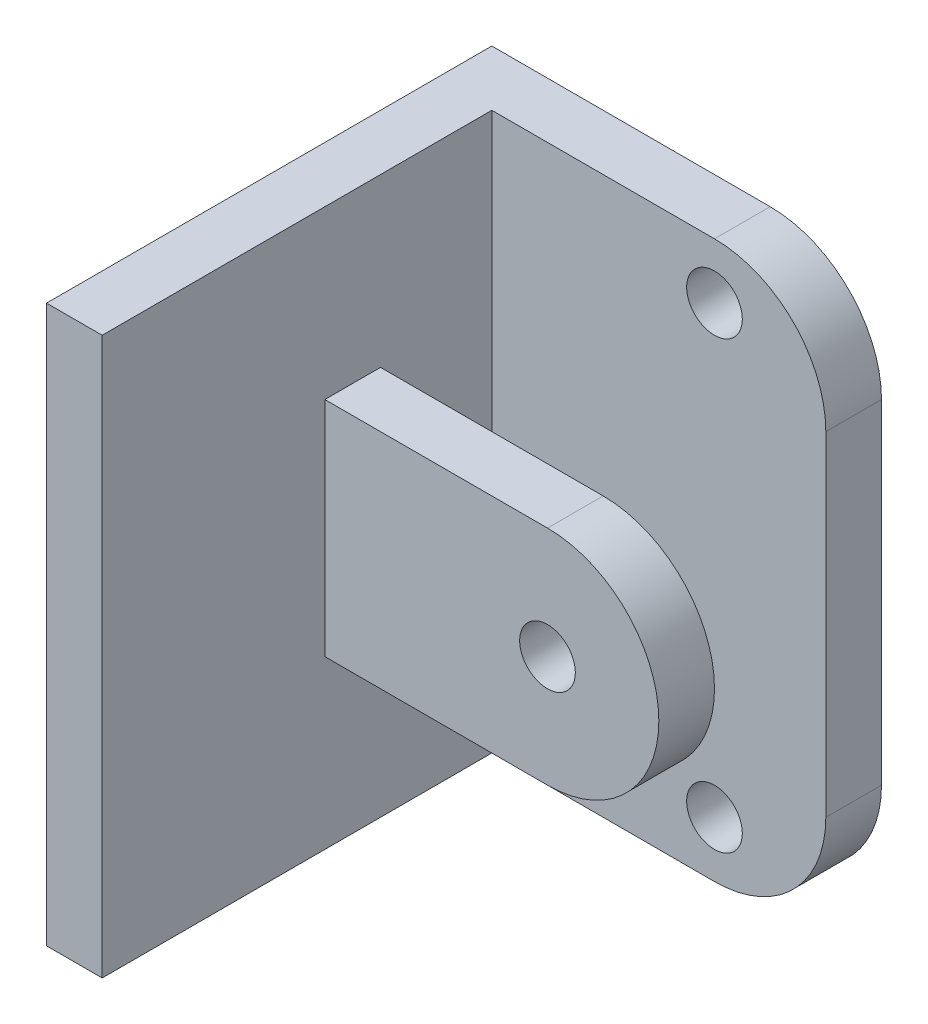
ISO-10303-21;
HEADER;
FILE_DESCRIPTION(('STEP AP214'),'2;1');
FILE_NAME('part.step','',(''),(''),'','','');
FILE_SCHEMA(('AUTOMOTIVE_DESIGN { 1 0 10303 214 1 1 1 1 }'));
ENDSEC;
DATA;
#1=APPLICATION_CONTEXT('core data for automotive mechanical design processes');
#2=APPLICATION_PROTOCOL_DEFINITION('international standard','automotive_design',2000,#1);
#3=PRODUCT_CONTEXT('',#1,'mechanical');
#4=PRODUCT('Part','Part','',(#3));
#5=PRODUCT_RELATED_PRODUCT_CATEGORY('part','',(#4));
#6=PRODUCT_DEFINITION_FORMATION('','',#4);
#7=PRODUCT_DEFINITION_CONTEXT('part definition',#1,'design');
#8=PRODUCT_DEFINITION('design','',#6,#7);
#9=PRODUCT_DEFINITION_SHAPE('','',#8);
#10=(LENGTH_UNIT() NAMED_UNIT(*) SI_UNIT(.MILLI.,.METRE.));
#11=(NAMED_UNIT(*) PLANE_ANGLE_UNIT() SI_UNIT($,.RADIAN.));
#12=(NAMED_UNIT(*) SI_UNIT($,.STERADIAN.) SOLID_ANGLE_UNIT());
#13=UNCERTAINTY_MEASURE_WITH_UNIT(LENGTH_MEASURE(1.E-05),#10,'distance_accuracy_value','');
#14=(GEOMETRIC_REPRESENTATION_CONTEXT(3) GLOBAL_UNCERTAINTY_ASSIGNED_CONTEXT((#13)) GLOBAL_UNIT_ASSIGNED_CONTEXT((#10,
#11,#12)) REPRESENTATION_CONTEXT('',''));
#15=CARTESIAN_POINT('',(0.,0.,0.));
#16=DIRECTION('',(0.,0.,1.));
#17=DIRECTION('',(1.,0.,0.));
#18=AXIS2_PLACEMENT_3D('',#15,#16,#17);
#19=CARTESIAN_POINT('',(-15.063803348918,-6.95245415864514,-15.));
#20=DIRECTION('',(0.,0.,1.));
#21=DIRECTION('',(0.,-1.,0.));
#22=AXIS2_PLACEMENT_3D('',#19,#20,#21);
#23=CYLINDRICAL_SURFACE('',#22,10.);
#24=DIRECTION('',(0.,0.,1.));
#25=VECTOR('',#24,1.);
#26=CARTESIAN_POINT('',(-15.063803348918,-16.9524541586451,-15.));
#27=LINE('',#26,#25);
#28=CARTESIAN_POINT('',(-15.063803348918,-16.9524541586451,-15.));
#29=VERTEX_POINT('',#28);
#30=CARTESIAN_POINT('',(-15.063803348918,-16.9524541586451,-10.));
#31=VERTEX_POINT('',#30);
#32=EDGE_CURVE('E232',#29,#31,#27,.T.);
#33=ORIENTED_EDGE('',*,*,#32,.F.);
#34=CARTESIAN_POINT('',(-15.063803348918,-6.95245415864514,-15.));
#35=DIRECTION('',(0.,0.,1.));
#36=DIRECTION('',(0.,-1.,0.));
#37=AXIS2_PLACEMENT_3D('',#34,#35,#36);
#38=CIRCLE('',#37,10.);
#39=CARTESIAN_POINT('',(-5.06380334891798,-6.95245415864514,-15.));
#40=VERTEX_POINT('',#39);
#41=EDGE_CURVE('E61',#40,#29,#38,.F.);
#42=ORIENTED_EDGE('',*,*,#41,.F.);
#43=DIRECTION('',(0.,0.,1.));
#44=VECTOR('',#43,1.);
#45=CARTESIAN_POINT('',(-5.06380334891798,-6.95245415864514,0.));
#46=LINE('',#45,#44);
#47=CARTESIAN_POINT('',(-5.06380334891798,-6.95245415864514,-10.));
#48=VERTEX_POINT('',#47);
#49=EDGE_CURVE('E235',#48,#40,#46,.F.);
#50=ORIENTED_EDGE('',*,*,#49,.F.);
#51=CARTESIAN_POINT('',(-15.063803348918,-6.95245415864514,-10.));
#52=DIRECTION('',(0.,0.,-1.));
#53=DIRECTION('',(0.,1.,0.));
#54=AXIS2_PLACEMENT_3D('',#51,#52,#53);
#55=CIRCLE('',#54,10.);
#56=EDGE_CURVE('E12',#31,#48,#55,.F.);
#57=ORIENTED_EDGE('',*,*,#56,.F.);
#58=EDGE_LOOP('',(#33,#42,#50,#57));
#59=FACE_BOUND('',#58,.T.);
#60=ADVANCED_FACE('F54',(#59),#23,.T.);
#61=CARTESIAN_POINT('',(-15.063803348918,23.0475458413549,0.));
#62=DIRECTION('',(0.,0.,1.));
#63=DIRECTION('',(1.,0.,0.));
#64=AXIS2_PLACEMENT_3D('',#61,#62,#63);
#65=CYLINDRICAL_SURFACE('',#64,10.);
#66=DIRECTION('',(0.,0.,1.));
#67=VECTOR('',#66,1.);
#68=CARTESIAN_POINT('',(-5.06380334891798,23.0475458413549,0.));
#69=LINE('',#68,#67);
#70=CARTESIAN_POINT('',(-5.06380334891798,23.0475458413549,-15.));
#71=VERTEX_POINT('',#70);
#72=CARTESIAN_POINT('',(-5.06380334891798,23.0475458413549,-10.));
#73=VERTEX_POINT('',#72);
#74=EDGE_CURVE('E223',#71,#73,#69,.T.);
#75=ORIENTED_EDGE('',*,*,#74,.F.);
#76=CARTESIAN_POINT('',(-15.063803348918,23.0475458413549,-15.));
#77=DIRECTION('',(0.,0.,1.));
#78=DIRECTION('',(0.,-1.,0.));
#79=AXIS2_PLACEMENT_3D('',#76,#77,#78);
#80=CIRCLE('',#79,10.);
#81=CARTESIAN_POINT('',(-15.063803348918,33.0475458413549,-15.));
#82=VERTEX_POINT('',#81);
#83=EDGE_CURVE('E228',#82,#71,#80,.F.);
#84=ORIENTED_EDGE('',*,*,#83,.F.);
#85=DIRECTION('',(0.,0.,1.));
#86=VECTOR('',#85,1.);
#87=CARTESIAN_POINT('',(-15.063803348918,33.0475458413549,-15.));
#88=LINE('',#87,#86);
#89=CARTESIAN_POINT('',(-15.063803348918,33.0475458413549,-10.));
#90=VERTEX_POINT('',#89);
#91=EDGE_CURVE('E226',#90,#82,#88,.F.);
#92=ORIENTED_EDGE('',*,*,#91,.F.);
#93=CARTESIAN_POINT('',(-15.063803348918,23.0475458413549,-10.));
#94=DIRECTION('',(0.,0.,-1.));
#95=DIRECTION('',(0.,1.,0.));
#96=AXIS2_PLACEMENT_3D('',#93,#94,#95);
#97=CIRCLE('',#96,10.);
#98=EDGE_CURVE('E144',#73,#90,#97,.F.);
#99=ORIENTED_EDGE('',*,*,#98,.F.);
#100=EDGE_LOOP('',(#75,#84,#92,#99));
#101=FACE_BOUND('',#100,.T.);
#102=ADVANCED_FACE('F252',(#101),#65,.T.);
#103=CARTESIAN_POINT('',(-35.063803348918,0.,0.));
#104=DIRECTION('',(-1.,0.,0.));
#105=DIRECTION('',(0.,0.,1.));
#106=AXIS2_PLACEMENT_3D('',#103,#104,#105);
#107=PLANE('',#106);
#108=DIRECTION('',(0.,-1.,0.));
#109=VECTOR('',#108,1.);
#110=CARTESIAN_POINT('',(-35.063803348918,0.,0.));
#111=LINE('',#110,#109);
#112=CARTESIAN_POINT('',(-35.063803348918,18.0475458413549,0.));
#113=VERTEX_POINT('',#112);
#114=CARTESIAN_POINT('',(-35.063803348918,-1.95245415864514,0.));
#115=VERTEX_POINT('',#114);
#116=EDGE_CURVE('E200',#113,#115,#111,.T.);
#117=ORIENTED_EDGE('',*,*,#116,.T.);
#118=DIRECTION('',(0.,0.,-1.));
#119=VECTOR('',#118,1.);
#120=CARTESIAN_POINT('',(-35.063803348918,-1.95245415864514,5.));
#121=LINE('',#120,#119);
#122=CARTESIAN_POINT('',(-35.063803348918,-1.95245415864514,5.));
#123=VERTEX_POINT('',#122);
#124=EDGE_CURVE('E208',#123,#115,#121,.T.);
#125=ORIENTED_EDGE('',*,*,#124,.F.);
#126=DIRECTION('',(0.,-1.,0.));
#127=VECTOR('',#126,1.);
#128=CARTESIAN_POINT('',(-35.063803348918,0.,5.));
#129=LINE('',#128,#127);
#130=CARTESIAN_POINT('',(-35.063803348918,18.0475458413549,5.));
#131=VERTEX_POINT('',#130);
#132=EDGE_CURVE('E206',#131,#123,#129,.T.);
#133=ORIENTED_EDGE('',*,*,#132,.F.);
#134=DIRECTION('',(0.,0.,-1.));
#135=VECTOR('',#134,1.);
#136=CARTESIAN_POINT('',(-35.063803348918,18.0475458413549,5.));
#137=LINE('',#136,#135);
#138=EDGE_CURVE('E220',#131,#113,#137,.T.);
#139=ORIENTED_EDGE('',*,*,#138,.T.);
#140=EDGE_LOOP('',(#117,#125,#133,#139));
#141=FACE_BOUND('',#140,.T.);
#142=DIRECTION('',(0.,-1.,0.));
#143=VECTOR('',#142,1.);
#144=CARTESIAN_POINT('',(-35.063803348918,33.0475458413549,-10.));
#145=LINE('',#144,#143);
#146=CARTESIAN_POINT('',(-35.063803348918,33.0475458413549,-10.));
#147=VERTEX_POINT('',#146);
#148=CARTESIAN_POINT('',(-35.063803348918,-16.9524541586451,-10.));
#149=VERTEX_POINT('',#148);
#150=EDGE_CURVE('E142',#147,#149,#145,.T.);
#151=ORIENTED_EDGE('',*,*,#150,.F.);
#152=DIRECTION('',(0.,0.,-1.));
#153=VECTOR('',#152,1.);
#154=CARTESIAN_POINT('',(-35.063803348918,33.0475458413549,-15.));
#155=LINE('',#154,#153);
#156=CARTESIAN_POINT('',(-35.063803348918,33.0475458413549,25.));
#157=VERTEX_POINT('',#156);
#158=EDGE_CURVE('E156',#157,#147,#155,.T.);
#159=ORIENTED_EDGE('',*,*,#158,.F.);
#160=DIRECTION('',(0.,1.,0.));
#161=VECTOR('',#160,1.);
#162=CARTESIAN_POINT('',(-35.063803348918,33.0475458413549,25.));
#163=LINE('',#162,#161);
#164=CARTESIAN_POINT('',(-35.063803348918,-16.9524541586451,25.));
#165=VERTEX_POINT('',#164);
#166=EDGE_CURVE('E166',#165,#157,#163,.T.);
#167=ORIENTED_EDGE('',*,*,#166,.F.);
#168=DIRECTION('',(0.,0.,1.));
#169=VECTOR('',#168,1.);
#170=CARTESIAN_POINT('',(-35.063803348918,-16.9524541586451,-15.));
#171=LINE('',#170,#169);
#172=EDGE_CURVE('E149',#149,#165,#171,.T.);
#173=ORIENTED_EDGE('',*,*,#172,.F.);
#174=EDGE_LOOP('',(#151,#159,#167,#173));
#175=FACE_BOUND('',#174,.T.);
#176=ADVANCED_FACE('F154',(#141,#175),#107,.F.);
#177=CARTESIAN_POINT('',(0.,0.,5.));
#178=DIRECTION('',(0.,0.,1.));
#179=DIRECTION('',(1.,0.,0.));
#180=AXIS2_PLACEMENT_3D('',#177,#178,#179);
#181=PLANE('',#180);
#182=CARTESIAN_POINT('',(-15.063803348918,8.04754584135486,5.));
#183=DIRECTION('',(0.,0.,1.));
#184=DIRECTION('',(1.,0.,0.));
#185=AXIS2_PLACEMENT_3D('',#182,#183,#184);
#186=CIRCLE('',#185,2.5);
#187=CARTESIAN_POINT('',(-12.563803348918,8.04754584135486,5.));
#188=VERTEX_POINT('',#187);
#189=EDGE_CURVE('E196',#188,#188,#186,.T.);
#190=ORIENTED_EDGE('',*,*,#189,.F.);
#191=EDGE_LOOP('',(#190));
#192=FACE_BOUND('',#191,.T.);
#193=DIRECTION('',(1.,0.,0.));
#194=VECTOR('',#193,1.);
#195=CARTESIAN_POINT('',(0.,-1.95245415864514,5.));
#196=LINE('',#195,#194);
#197=CARTESIAN_POINT('',(-15.063803348918,-1.95245415864514,5.));
#198=VERTEX_POINT('',#197);
#199=EDGE_CURVE('E199',#123,#198,#196,.T.);
#200=ORIENTED_EDGE('',*,*,#199,.T.);
#201=CARTESIAN_POINT('',(-15.063803348918,8.04754584135486,5.));
#202=DIRECTION('',(0.,0.,1.));
#203=DIRECTION('',(1.,0.,0.));
#204=AXIS2_PLACEMENT_3D('',#201,#202,#203);
#205=CIRCLE('',#204,10.);
#206=CARTESIAN_POINT('',(-15.063803348918,18.0475458413549,5.));
#207=VERTEX_POINT('',#206);
#208=EDGE_CURVE('E188',#198,#207,#205,.T.);
#209=ORIENTED_EDGE('',*,*,#208,.T.);
#210=DIRECTION('',(1.,0.,0.));
#211=VECTOR('',#210,1.);
#212=CARTESIAN_POINT('',(0.,18.0475458413549,5.));
#213=LINE('',#212,#211);
#214=EDGE_CURVE('E203',#131,#207,#213,.T.);
#215=ORIENTED_EDGE('',*,*,#214,.F.);
#216=ORIENTED_EDGE('',*,*,#132,.T.);
#217=EDGE_LOOP('',(#200,#209,#215,#216));
#218=FACE_BOUND('',#217,.T.);
#219=ADVANCED_FACE('F280',(#192,#218),#181,.T.);
#220=CARTESIAN_POINT('',(0.,0.,0.));
#221=DIRECTION('',(0.,0.,1.));
#222=DIRECTION('',(1.,0.,0.));
#223=AXIS2_PLACEMENT_3D('',#220,#221,#222);
#224=PLANE('',#223);
#225=CARTESIAN_POINT('',(-15.063803348918,8.04754584135486,0.));
#226=DIRECTION('',(0.,0.,1.));
#227=DIRECTION('',(1.,0.,0.));
#228=AXIS2_PLACEMENT_3D('',#225,#226,#227);
#229=CIRCLE('',#228,2.5);
#230=CARTESIAN_POINT('',(-12.563803348918,8.04754584135486,0.));
#231=VERTEX_POINT('',#230);
#232=EDGE_CURVE('E195',#231,#231,#229,.T.);
#233=ORIENTED_EDGE('',*,*,#232,.T.);
#234=EDGE_LOOP('',(#233));
#235=FACE_BOUND('',#234,.T.);
#236=CARTESIAN_POINT('',(-15.063803348918,8.04754584135486,0.));
#237=DIRECTION('',(0.,0.,1.));
#238=DIRECTION('',(1.,0.,0.));
#239=AXIS2_PLACEMENT_3D('',#236,#237,#238);
#240=CIRCLE('',#239,10.);
#241=CARTESIAN_POINT('',(-15.063803348918,-1.95245415864514,0.));
#242=VERTEX_POINT('',#241);
#243=CARTESIAN_POINT('',(-15.063803348918,18.0475458413549,0.));
#244=VERTEX_POINT('',#243);
#245=EDGE_CURVE('E189',#242,#244,#240,.T.);
#246=ORIENTED_EDGE('',*,*,#245,.F.);
#247=DIRECTION('',(1.,0.,0.));
#248=VECTOR('',#247,1.);
#249=CARTESIAN_POINT('',(0.,-1.95245415864514,0.));
#250=LINE('',#249,#248);
#251=EDGE_CURVE('E211',#115,#242,#250,.T.);
#252=ORIENTED_EDGE('',*,*,#251,.F.);
#253=ORIENTED_EDGE('',*,*,#116,.F.);
#254=DIRECTION('',(1.,0.,0.));
#255=VECTOR('',#254,1.);
#256=CARTESIAN_POINT('',(0.,18.0475458413549,0.));
#257=LINE('',#256,#255);
#258=EDGE_CURVE('E214',#113,#244,#257,.T.);
#259=ORIENTED_EDGE('',*,*,#258,.T.);
#260=EDGE_LOOP('',(#246,#252,#253,#259));
#261=FACE_BOUND('',#260,.T.);
#262=ADVANCED_FACE('F293',(#235,#261),#224,.F.);
#263=CARTESIAN_POINT('',(0.,-1.95245415864514,5.));
#264=DIRECTION('',(0.,1.,0.));
#265=DIRECTION('',(0.,0.,1.));
#266=AXIS2_PLACEMENT_3D('',#263,#264,#265);
#267=PLANE('',#266);
#268=ORIENTED_EDGE('',*,*,#251,.T.);
#269=DIRECTION('',(0.,0.,1.));
#270=VECTOR('',#269,1.);
#271=CARTESIAN_POINT('',(-15.063803348918,-1.95245415864514,0.));
#272=LINE('',#271,#270);
#273=EDGE_CURVE('E185',#242,#198,#272,.T.);
#274=ORIENTED_EDGE('',*,*,#273,.T.);
#275=ORIENTED_EDGE('',*,*,#199,.F.);
#276=ORIENTED_EDGE('',*,*,#124,.T.);
#277=EDGE_LOOP('',(#268,#274,#275,#276));
#278=FACE_BOUND('',#277,.T.);
#279=ADVANCED_FACE('F290',(#278),#267,.F.);
#280=CARTESIAN_POINT('',(0.,18.0475458413549,5.));
#281=DIRECTION('',(0.,1.,0.));
#282=DIRECTION('',(0.,0.,1.));
#283=AXIS2_PLACEMENT_3D('',#280,#281,#282);
#284=PLANE('',#283);
#285=DIRECTION('',(0.,0.,1.));
#286=VECTOR('',#285,1.);
#287=CARTESIAN_POINT('',(-15.063803348918,18.0475458413549,0.));
#288=LINE('',#287,#286);
#289=EDGE_CURVE('E191',#244,#207,#288,.T.);
#290=ORIENTED_EDGE('',*,*,#289,.F.);
#291=ORIENTED_EDGE('',*,*,#258,.F.);
#292=ORIENTED_EDGE('',*,*,#138,.F.);
#293=ORIENTED_EDGE('',*,*,#214,.T.);
#294=EDGE_LOOP('',(#290,#291,#292,#293));
#295=FACE_BOUND('',#294,.T.);
#296=ADVANCED_FACE('F288',(#295),#284,.T.);
#297=CARTESIAN_POINT('',(-15.063803348918,8.04754584135486,5.));
#298=DIRECTION('',(0.,0.,-1.));
#299=DIRECTION('',(-1.,0.,0.));
#300=AXIS2_PLACEMENT_3D('',#297,#298,#299);
#301=CYLINDRICAL_SURFACE('',#300,2.5);
#302=ORIENTED_EDGE('',*,*,#189,.T.);
#303=EDGE_LOOP('',(#302));
#304=FACE_BOUND('',#303,.T.);
#305=ORIENTED_EDGE('',*,*,#232,.F.);
#306=EDGE_LOOP('',(#305));
#307=FACE_BOUND('',#306,.T.);
#308=ADVANCED_FACE('F284',(#304,#307),#301,.F.);
#309=CARTESIAN_POINT('',(-15.063803348918,8.04754584135486,0.));
#310=DIRECTION('',(0.,0.,1.));
#311=DIRECTION('',(1.,0.,0.));
#312=AXIS2_PLACEMENT_3D('',#309,#310,#311);
#313=CYLINDRICAL_SURFACE('',#312,10.);
#314=ORIENTED_EDGE('',*,*,#208,.F.);
#315=ORIENTED_EDGE('',*,*,#273,.F.);
#316=ORIENTED_EDGE('',*,*,#245,.T.);
#317=ORIENTED_EDGE('',*,*,#289,.T.);
#318=EDGE_LOOP('',(#314,#315,#316,#317));
#319=FACE_BOUND('',#318,.T.);
#320=ADVANCED_FACE('F287',(#319),#313,.T.);
#321=CARTESIAN_POINT('',(-40.063803348918,33.0475458413549,-15.));
#322=DIRECTION('',(0.,0.,1.));
#323=DIRECTION('',(0.,-1.,0.));
#324=AXIS2_PLACEMENT_3D('',#321,#322,#323);
#325=PLANE('',#324);
#326=CARTESIAN_POINT('',(-15.063803348918,-11.9524541586451,-15.));
#327=DIRECTION('',(0.,0.,1.));
#328=DIRECTION('',(0.,-1.,0.));
#329=AXIS2_PLACEMENT_3D('',#326,#327,#328);
#330=CIRCLE('',#329,2.5);
#331=CARTESIAN_POINT('',(-15.063803348918,-14.4524541586451,-15.));
#332=VERTEX_POINT('',#331);
#333=EDGE_CURVE('E314',#332,#332,#330,.T.);
#334=ORIENTED_EDGE('',*,*,#333,.T.);
#335=EDGE_LOOP('',(#334));
#336=FACE_BOUND('',#335,.T.);
#337=CARTESIAN_POINT('',(-15.063803348918,28.0475458413549,-15.));
#338=DIRECTION('',(0.,0.,1.));
#339=DIRECTION('',(0.,-1.,0.));
#340=AXIS2_PLACEMENT_3D('',#337,#338,#339);
#341=CIRCLE('',#340,2.5);
#342=CARTESIAN_POINT('',(-15.063803348918,25.5475458413549,-15.));
#343=VERTEX_POINT('',#342);
#344=EDGE_CURVE('E158',#343,#343,#341,.T.);
#345=ORIENTED_EDGE('',*,*,#344,.T.);
#346=EDGE_LOOP('',(#345));
#347=FACE_BOUND('',#346,.T.);
#348=DIRECTION('',(0.,1.,0.));
#349=VECTOR('',#348,1.);
#350=CARTESIAN_POINT('',(-5.06380334891798,33.0475458413549,-15.));
#351=LINE('',#350,#349);
#352=EDGE_CURVE('E157',#40,#71,#351,.T.);
#353=ORIENTED_EDGE('',*,*,#352,.F.);
#354=ORIENTED_EDGE('',*,*,#41,.T.);
#355=DIRECTION('',(1.,0.,0.));
#356=VECTOR('',#355,1.);
#357=CARTESIAN_POINT('',(-40.063803348918,-16.9524541586451,-15.));
#358=LINE('',#357,#356);
#359=CARTESIAN_POINT('',(-40.063803348918,-16.9524541586451,-15.));
#360=VERTEX_POINT('',#359);
#361=EDGE_CURVE('E182',#360,#29,#358,.T.);
#362=ORIENTED_EDGE('',*,*,#361,.F.);
#363=DIRECTION('',(0.,-1.,0.));
#364=VECTOR('',#363,1.);
#365=CARTESIAN_POINT('',(-40.063803348918,33.0475458413549,-15.));
#366=LINE('',#365,#364);
#367=CARTESIAN_POINT('',(-40.063803348918,33.0475458413549,-15.));
#368=VERTEX_POINT('',#367);
#369=EDGE_CURVE('E165',#368,#360,#366,.T.);
#370=ORIENTED_EDGE('',*,*,#369,.F.);
#371=DIRECTION('',(1.,0.,0.));
#372=VECTOR('',#371,1.);
#373=CARTESIAN_POINT('',(-40.063803348918,33.0475458413549,-15.));
#374=LINE('',#373,#372);
#375=EDGE_CURVE('E174',#368,#82,#374,.T.);
#376=ORIENTED_EDGE('',*,*,#375,.T.);
#377=ORIENTED_EDGE('',*,*,#83,.T.);
#378=EDGE_LOOP('',(#353,#354,#362,#370,#376,#377));
#379=FACE_BOUND('',#378,.T.);
#380=ADVANCED_FACE('F239',(#336,#347,#379),#325,.F.);
#381=CARTESIAN_POINT('',(-40.063803348918,-16.9524541586451,-15.));
#382=DIRECTION('',(0.,1.,0.));
#383=DIRECTION('',(0.,0.,1.));
#384=AXIS2_PLACEMENT_3D('',#381,#382,#383);
#385=PLANE('',#384);
#386=ORIENTED_EDGE('',*,*,#361,.T.);
#387=ORIENTED_EDGE('',*,*,#32,.T.);
#388=DIRECTION('',(-1.,0.,0.));
#389=VECTOR('',#388,1.);
#390=CARTESIAN_POINT('',(-5.06380334891798,-16.9524541586451,-10.));
#391=LINE('',#390,#389);
#392=EDGE_CURVE('E150',#31,#149,#391,.T.);
#393=ORIENTED_EDGE('',*,*,#392,.T.);
#394=ORIENTED_EDGE('',*,*,#172,.T.);
#395=DIRECTION('',(1.,0.,0.));
#396=VECTOR('',#395,1.);
#397=CARTESIAN_POINT('',(-40.063803348918,-16.9524541586451,25.));
#398=LINE('',#397,#396);
#399=CARTESIAN_POINT('',(-40.063803348918,-16.9524541586451,25.));
#400=VERTEX_POINT('',#399);
#401=EDGE_CURVE('E179',#400,#165,#398,.T.);
#402=ORIENTED_EDGE('',*,*,#401,.F.);
#403=DIRECTION('',(0.,0.,1.));
#404=VECTOR('',#403,1.);
#405=CARTESIAN_POINT('',(-40.063803348918,-16.9524541586451,-15.));
#406=LINE('',#405,#404);
#407=EDGE_CURVE('E169',#360,#400,#406,.T.);
#408=ORIENTED_EDGE('',*,*,#407,.F.);
#409=EDGE_LOOP('',(#386,#387,#393,#394,#402,#408));
#410=FACE_BOUND('',#409,.T.);
#411=ADVANCED_FACE('F242',(#410),#385,.F.);
#412=CARTESIAN_POINT('',(-40.063803348918,33.0475458413549,25.));
#413=DIRECTION('',(0.,0.,-1.));
#414=DIRECTION('',(0.,1.,0.));
#415=AXIS2_PLACEMENT_3D('',#412,#413,#414);
#416=PLANE('',#415);
#417=ORIENTED_EDGE('',*,*,#166,.T.);
#418=DIRECTION('',(1.,0.,0.));
#419=VECTOR('',#418,1.);
#420=CARTESIAN_POINT('',(-40.063803348918,33.0475458413549,25.));
#421=LINE('',#420,#419);
#422=CARTESIAN_POINT('',(-40.063803348918,33.0475458413549,25.));
#423=VERTEX_POINT('',#422);
#424=EDGE_CURVE('E164',#423,#157,#421,.T.);
#425=ORIENTED_EDGE('',*,*,#424,.F.);
#426=DIRECTION('',(0.,1.,0.));
#427=VECTOR('',#426,1.);
#428=CARTESIAN_POINT('',(-40.063803348918,33.0475458413549,25.));
#429=LINE('',#428,#427);
#430=EDGE_CURVE('E246',#400,#423,#429,.T.);
#431=ORIENTED_EDGE('',*,*,#430,.F.);
#432=ORIENTED_EDGE('',*,*,#401,.T.);
#433=EDGE_LOOP('',(#417,#425,#431,#432));
#434=FACE_BOUND('',#433,.T.);
#435=ADVANCED_FACE('F264',(#434),#416,.F.);
#436=CARTESIAN_POINT('',(-40.063803348918,33.0475458413549,-15.));
#437=DIRECTION('',(0.,-1.,0.));
#438=DIRECTION('',(0.,0.,-1.));
#439=AXIS2_PLACEMENT_3D('',#436,#437,#438);
#440=PLANE('',#439);
#441=DIRECTION('',(-1.,0.,0.));
#442=VECTOR('',#441,1.);
#443=CARTESIAN_POINT('',(-5.06380334891798,33.0475458413549,-10.));
#444=LINE('',#443,#442);
#445=EDGE_CURVE('E139',#90,#147,#444,.T.);
#446=ORIENTED_EDGE('',*,*,#445,.F.);
#447=ORIENTED_EDGE('',*,*,#91,.T.);
#448=ORIENTED_EDGE('',*,*,#375,.F.);
#449=DIRECTION('',(0.,0.,-1.));
#450=VECTOR('',#449,1.);
#451=CARTESIAN_POINT('',(-40.063803348918,33.0475458413549,-15.));
#452=LINE('',#451,#450);
#453=EDGE_CURVE('E177',#423,#368,#452,.T.);
#454=ORIENTED_EDGE('',*,*,#453,.F.);
#455=ORIENTED_EDGE('',*,*,#424,.T.);
#456=ORIENTED_EDGE('',*,*,#158,.T.);
#457=EDGE_LOOP('',(#446,#447,#448,#454,#455,#456));
#458=FACE_BOUND('',#457,.T.);
#459=ADVANCED_FACE('F161',(#458),#440,.F.);
#460=CARTESIAN_POINT('',(-40.063803348918,0.,0.));
#461=DIRECTION('',(-1.,0.,0.));
#462=DIRECTION('',(0.,0.,1.));
#463=AXIS2_PLACEMENT_3D('',#460,#461,#462);
#464=PLANE('',#463);
#465=ORIENTED_EDGE('',*,*,#369,.T.);
#466=ORIENTED_EDGE('',*,*,#407,.T.);
#467=ORIENTED_EDGE('',*,*,#430,.T.);
#468=ORIENTED_EDGE('',*,*,#453,.T.);
#469=EDGE_LOOP('',(#465,#466,#467,#468));
#470=FACE_BOUND('',#469,.T.);
#471=ADVANCED_FACE('F248',(#470),#464,.T.);
#472=CARTESIAN_POINT('',(-5.06380334891798,33.0475458413549,-10.));
#473=DIRECTION('',(0.,0.,-1.));
#474=DIRECTION('',(0.,1.,0.));
#475=AXIS2_PLACEMENT_3D('',#472,#473,#474);
#476=PLANE('',#475);
#477=CARTESIAN_POINT('',(-15.063803348918,-11.9524541586451,-10.));
#478=DIRECTION('',(0.,0.,1.));
#479=DIRECTION('',(1.,0.,0.));
#480=AXIS2_PLACEMENT_3D('',#477,#478,#479);
#481=CIRCLE('',#480,2.5);
#482=CARTESIAN_POINT('',(-12.563803348918,-11.9524541586451,-10.));
#483=VERTEX_POINT('',#482);
#484=EDGE_CURVE('E323',#483,#483,#481,.T.);
#485=ORIENTED_EDGE('',*,*,#484,.F.);
#486=EDGE_LOOP('',(#485));
#487=FACE_BOUND('',#486,.T.);
#488=CARTESIAN_POINT('',(-15.063803348918,28.0475458413549,-10.));
#489=DIRECTION('',(0.,0.,1.));
#490=DIRECTION('',(1.,0.,0.));
#491=AXIS2_PLACEMENT_3D('',#488,#489,#490);
#492=CIRCLE('',#491,2.5);
#493=CARTESIAN_POINT('',(-12.563803348918,28.0475458413549,-10.));
#494=VERTEX_POINT('',#493);
#495=EDGE_CURVE('E318',#494,#494,#492,.T.);
#496=ORIENTED_EDGE('',*,*,#495,.F.);
#497=EDGE_LOOP('',(#496));
#498=FACE_BOUND('',#497,.T.);
#499=ORIENTED_EDGE('',*,*,#392,.F.);
#500=ORIENTED_EDGE('',*,*,#56,.T.);
#501=DIRECTION('',(0.,-1.,0.));
#502=VECTOR('',#501,1.);
#503=CARTESIAN_POINT('',(-5.06380334891798,33.0475458413549,-10.));
#504=LINE('',#503,#502);
#505=EDGE_CURVE('E256',#73,#48,#504,.T.);
#506=ORIENTED_EDGE('',*,*,#505,.F.);
#507=ORIENTED_EDGE('',*,*,#98,.T.);
#508=ORIENTED_EDGE('',*,*,#445,.T.);
#509=ORIENTED_EDGE('',*,*,#150,.T.);
#510=EDGE_LOOP('',(#499,#500,#506,#507,#508,#509));
#511=FACE_BOUND('',#510,.T.);
#512=ADVANCED_FACE('F141',(#487,#498,#511),#476,.F.);
#513=CARTESIAN_POINT('',(-5.06380334891798,0.,0.));
#514=DIRECTION('',(-1.,0.,0.));
#515=DIRECTION('',(0.,0.,1.));
#516=AXIS2_PLACEMENT_3D('',#513,#514,#515);
#517=PLANE('',#516);
#518=ORIENTED_EDGE('',*,*,#505,.T.);
#519=ORIENTED_EDGE('',*,*,#49,.T.);
#520=ORIENTED_EDGE('',*,*,#352,.T.);
#521=ORIENTED_EDGE('',*,*,#74,.T.);
#522=EDGE_LOOP('',(#518,#519,#520,#521));
#523=FACE_BOUND('',#522,.T.);
#524=ADVANCED_FACE('F255',(#523),#517,.F.);
#525=CARTESIAN_POINT('',(-15.063803348918,28.0475458413549,-30.));
#526=DIRECTION('',(0.,0.,1.));
#527=DIRECTION('',(1.,0.,0.));
#528=AXIS2_PLACEMENT_3D('',#525,#526,#527);
#529=CYLINDRICAL_SURFACE('',#528,2.5);
#530=ORIENTED_EDGE('',*,*,#495,.T.);
#531=EDGE_LOOP('',(#530));
#532=FACE_BOUND('',#531,.T.);
#533=ORIENTED_EDGE('',*,*,#344,.F.);
#534=EDGE_LOOP('',(#533));
#535=FACE_BOUND('',#534,.T.);
#536=ADVANCED_FACE('F335',(#532,#535),#529,.F.);
#537=CARTESIAN_POINT('',(-15.063803348918,-11.9524541586451,-30.));
#538=DIRECTION('',(0.,0.,1.));
#539=DIRECTION('',(1.,0.,0.));
#540=AXIS2_PLACEMENT_3D('',#537,#538,#539);
#541=CYLINDRICAL_SURFACE('',#540,2.5);
#542=ORIENTED_EDGE('',*,*,#484,.T.);
#543=EDGE_LOOP('',(#542));
#544=FACE_BOUND('',#543,.T.);
#545=ORIENTED_EDGE('',*,*,#333,.F.);
#546=EDGE_LOOP('',(#545));
#547=FACE_BOUND('',#546,.T.);
#548=ADVANCED_FACE('F327',(#544,#547),#541,.F.);
#549=CLOSED_SHELL('',(#60,#102,#176,#219,#262,#279,#296,#308,#320,#380,#411,#435,#459,#471,#512,
#524,#536,#548));
#550=MANIFOLD_SOLID_BREP('B2',#549);
#551=ADVANCED_BREP_SHAPE_REPRESENTATION('',(#18,#550),#14);
#552=SHAPE_DEFINITION_REPRESENTATION(#9,#551);
ENDSEC;
END-ISO-10303-21;
